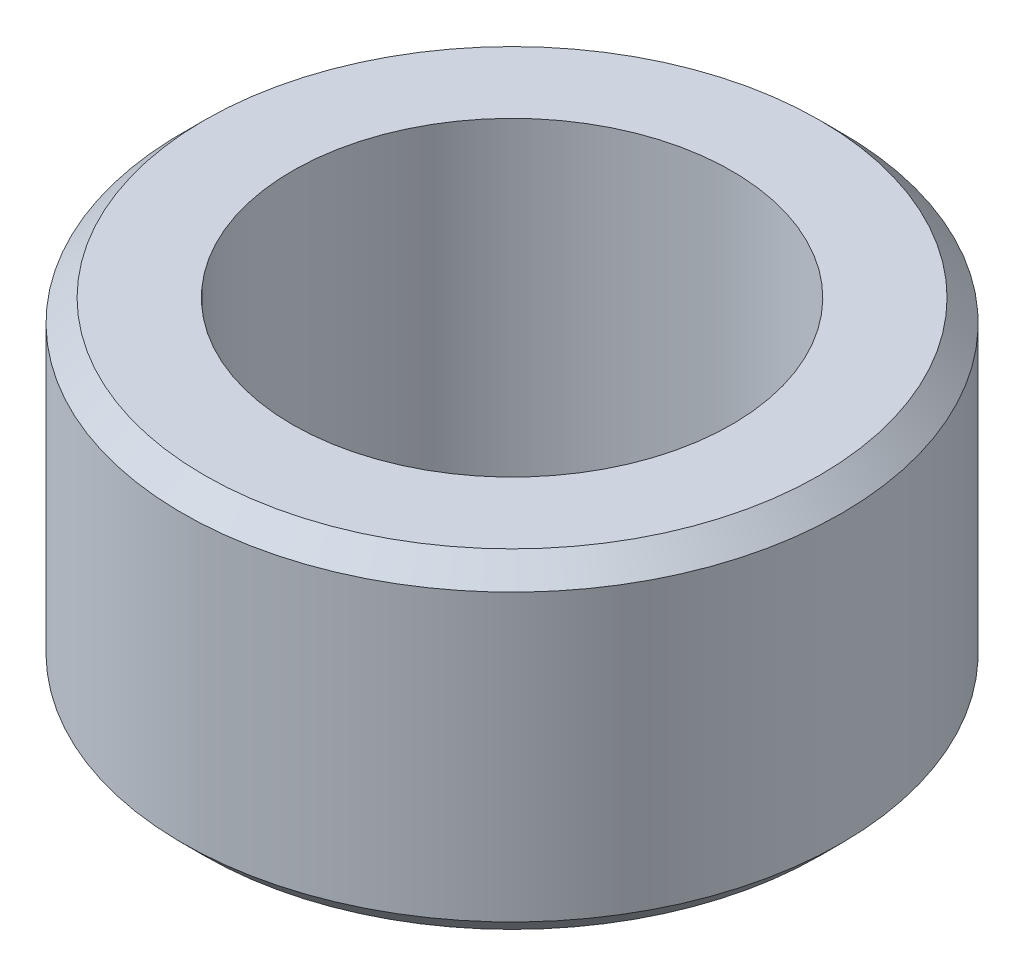
ISO-10303-21;
HEADER;
FILE_DESCRIPTION(('STEP AP214'),'2;1');
FILE_NAME('part.step','',(''),(''),'','','');
FILE_SCHEMA(('AUTOMOTIVE_DESIGN { 1 0 10303 214 1 1 1 1 }'));
ENDSEC;
DATA;
#1=APPLICATION_CONTEXT('core data for automotive mechanical design processes');
#2=APPLICATION_PROTOCOL_DEFINITION('international standard','automotive_design',2000,#1);
#3=PRODUCT_CONTEXT('',#1,'mechanical');
#4=PRODUCT('Part','Part','',(#3));
#5=PRODUCT_RELATED_PRODUCT_CATEGORY('part','',(#4));
#6=PRODUCT_DEFINITION_FORMATION('','',#4);
#7=PRODUCT_DEFINITION_CONTEXT('part definition',#1,'design');
#8=PRODUCT_DEFINITION('design','',#6,#7);
#9=PRODUCT_DEFINITION_SHAPE('','',#8);
#10=(LENGTH_UNIT() NAMED_UNIT(*) SI_UNIT(.MILLI.,.METRE.));
#11=(NAMED_UNIT(*) PLANE_ANGLE_UNIT() SI_UNIT($,.RADIAN.));
#12=(NAMED_UNIT(*) SI_UNIT($,.STERADIAN.) SOLID_ANGLE_UNIT());
#13=UNCERTAINTY_MEASURE_WITH_UNIT(LENGTH_MEASURE(1.E-05),#10,'distance_accuracy_value','');
#14=(GEOMETRIC_REPRESENTATION_CONTEXT(3) GLOBAL_UNCERTAINTY_ASSIGNED_CONTEXT((#13)) GLOBAL_UNIT_ASSIGNED_CONTEXT((#10,
#11,#12)) REPRESENTATION_CONTEXT('',''));
#15=CARTESIAN_POINT('',(0.,0.,0.));
#16=DIRECTION('',(0.,0.,1.));
#17=DIRECTION('',(1.,0.,0.));
#18=AXIS2_PLACEMENT_3D('',#15,#16,#17);
#19=CARTESIAN_POINT('',(0.,15.,0.));
#20=DIRECTION('',(0.,1.,0.));
#21=DIRECTION('',(0.,0.,1.));
#22=AXIS2_PLACEMENT_3D('',#19,#20,#21);
#23=PLANE('',#22);
#24=CARTESIAN_POINT('',(0.,15.,0.));
#25=DIRECTION('',(0.,1.,0.));
#26=DIRECTION('',(0.,0.,1.));
#27=AXIS2_PLACEMENT_3D('',#24,#25,#26);
#28=CIRCLE('',#27,10.);
#29=CARTESIAN_POINT('',(0.,15.,10.));
#30=VERTEX_POINT('',#29);
#31=EDGE_CURVE('E10',#30,#30,#28,.T.);
#32=ORIENTED_EDGE('',*,*,#31,.F.);
#33=EDGE_LOOP('',(#32));
#34=FACE_BOUND('',#33,.T.);
#35=CARTESIAN_POINT('',(0.,14.9999999999999,0.));
#36=DIRECTION('',(0.,-1.,0.));
#37=DIRECTION('',(1.,0.,0.));
#38=AXIS2_PLACEMENT_3D('',#35,#36,#37);
#39=CIRCLE('',#38,13.9999999999999);
#40=CARTESIAN_POINT('',(13.9999999999999,15.,0.));
#41=VERTEX_POINT('',#40);
#42=EDGE_CURVE('E47',#41,#41,#39,.T.);
#43=ORIENTED_EDGE('',*,*,#42,.F.);
#44=EDGE_LOOP('',(#43));
#45=FACE_BOUND('',#44,.T.);
#46=ADVANCED_FACE('F36',(#34,#45),#23,.T.);
#47=CARTESIAN_POINT('',(0.,0.,0.));
#48=DIRECTION('',(0.,1.,0.));
#49=DIRECTION('',(0.,0.,1.));
#50=AXIS2_PLACEMENT_3D('',#47,#48,#49);
#51=PLANE('',#50);
#52=CARTESIAN_POINT('',(0.,0.,0.));
#53=DIRECTION('',(0.,1.,0.));
#54=DIRECTION('',(0.,0.,1.));
#55=AXIS2_PLACEMENT_3D('',#52,#53,#54);
#56=CIRCLE('',#55,10.);
#57=CARTESIAN_POINT('',(0.,0.,10.));
#58=VERTEX_POINT('',#57);
#59=EDGE_CURVE('E40',#58,#58,#56,.T.);
#60=ORIENTED_EDGE('',*,*,#59,.T.);
#61=EDGE_LOOP('',(#60));
#62=FACE_BOUND('',#61,.T.);
#63=CARTESIAN_POINT('',(0.,0.,0.));
#64=DIRECTION('',(0.,-1.,0.));
#65=DIRECTION('',(1.,0.,0.));
#66=AXIS2_PLACEMENT_3D('',#63,#64,#65);
#67=CIRCLE('',#66,14.);
#68=CARTESIAN_POINT('',(14.,0.,0.));
#69=VERTEX_POINT('',#68);
#70=EDGE_CURVE('E49',#69,#69,#67,.T.);
#71=ORIENTED_EDGE('',*,*,#70,.T.);
#72=EDGE_LOOP('',(#71));
#73=FACE_BOUND('',#72,.T.);
#74=ADVANCED_FACE('F76',(#62,#73),#51,.F.);
#75=CARTESIAN_POINT('',(0.,15.,0.));
#76=DIRECTION('',(0.,-1.,0.));
#77=DIRECTION('',(0.,0.,-1.));
#78=AXIS2_PLACEMENT_3D('',#75,#76,#77);
#79=CYLINDRICAL_SURFACE('',#78,10.);
#80=ORIENTED_EDGE('',*,*,#31,.T.);
#81=EDGE_LOOP('',(#80));
#82=FACE_BOUND('',#81,.T.);
#83=ORIENTED_EDGE('',*,*,#59,.F.);
#84=EDGE_LOOP('',(#83));
#85=FACE_BOUND('',#84,.T.);
#86=ADVANCED_FACE('F72',(#82,#85),#79,.F.);
#87=CARTESIAN_POINT('',(0.,0.,0.));
#88=DIRECTION('',(0.,1.,0.));
#89=DIRECTION('',(-1.,0.,0.));
#90=AXIS2_PLACEMENT_3D('',#87,#88,#89);
#91=CONICAL_SURFACE('',#90,14.,0.785398163397502);
#92=CARTESIAN_POINT('',(0.,0.99999999999989,0.));
#93=DIRECTION('',(0.,-1.,0.));
#94=DIRECTION('',(1.,0.,0.));
#95=AXIS2_PLACEMENT_3D('',#92,#93,#94);
#96=CIRCLE('',#95,15.);
#97=CARTESIAN_POINT('',(15.,0.999999999999941,0.));
#98=VERTEX_POINT('',#97);
#99=EDGE_CURVE('E53',#98,#98,#96,.T.);
#100=ORIENTED_EDGE('',*,*,#99,.T.);
#101=EDGE_LOOP('',(#100));
#102=FACE_BOUND('',#101,.T.);
#103=ORIENTED_EDGE('',*,*,#70,.F.);
#104=EDGE_LOOP('',(#103));
#105=FACE_BOUND('',#104,.T.);
#106=ADVANCED_FACE('F64',(#102,#105),#91,.T.);
#107=CARTESIAN_POINT('',(0.,14.,0.));
#108=DIRECTION('',(0.,-1.,0.));
#109=DIRECTION('',(1.,0.,0.));
#110=AXIS2_PLACEMENT_3D('',#107,#108,#109);
#111=CONICAL_SURFACE('',#110,15.,0.785398163397506);
#112=ORIENTED_EDGE('',*,*,#42,.T.);
#113=EDGE_LOOP('',(#112));
#114=FACE_BOUND('',#113,.T.);
#115=CARTESIAN_POINT('',(0.,14.,0.));
#116=DIRECTION('',(0.,-1.,0.));
#117=DIRECTION('',(1.,0.,0.));
#118=AXIS2_PLACEMENT_3D('',#115,#116,#117);
#119=CIRCLE('',#118,15.);
#120=CARTESIAN_POINT('',(14.9999999999999,14.0000000000001,0.));
#121=VERTEX_POINT('',#120);
#122=EDGE_CURVE('E52',#121,#121,#119,.T.);
#123=ORIENTED_EDGE('',*,*,#122,.F.);
#124=EDGE_LOOP('',(#123));
#125=FACE_BOUND('',#124,.T.);
#126=ADVANCED_FACE('F62',(#114,#125),#111,.T.);
#127=CARTESIAN_POINT('',(0.,15.,0.));
#128=DIRECTION('',(0.,-1.,0.));
#129=DIRECTION('',(0.,0.,-1.));
#130=AXIS2_PLACEMENT_3D('',#127,#128,#129);
#131=CYLINDRICAL_SURFACE('',#130,15.);
#132=ORIENTED_EDGE('',*,*,#99,.F.);
#133=EDGE_LOOP('',(#132));
#134=FACE_BOUND('',#133,.T.);
#135=ORIENTED_EDGE('',*,*,#122,.T.);
#136=EDGE_LOOP('',(#135));
#137=FACE_BOUND('',#136,.T.);
#138=ADVANCED_FACE('F38',(#134,#137),#131,.T.);
#139=CLOSED_SHELL('',(#46,#74,#86,#106,#126,#138));
#140=MANIFOLD_SOLID_BREP('B2',#139);
#141=ADVANCED_BREP_SHAPE_REPRESENTATION('',(#18,#140),#14);
#142=SHAPE_DEFINITION_REPRESENTATION(#9,#141);
ENDSEC;
END-ISO-10303-21;
